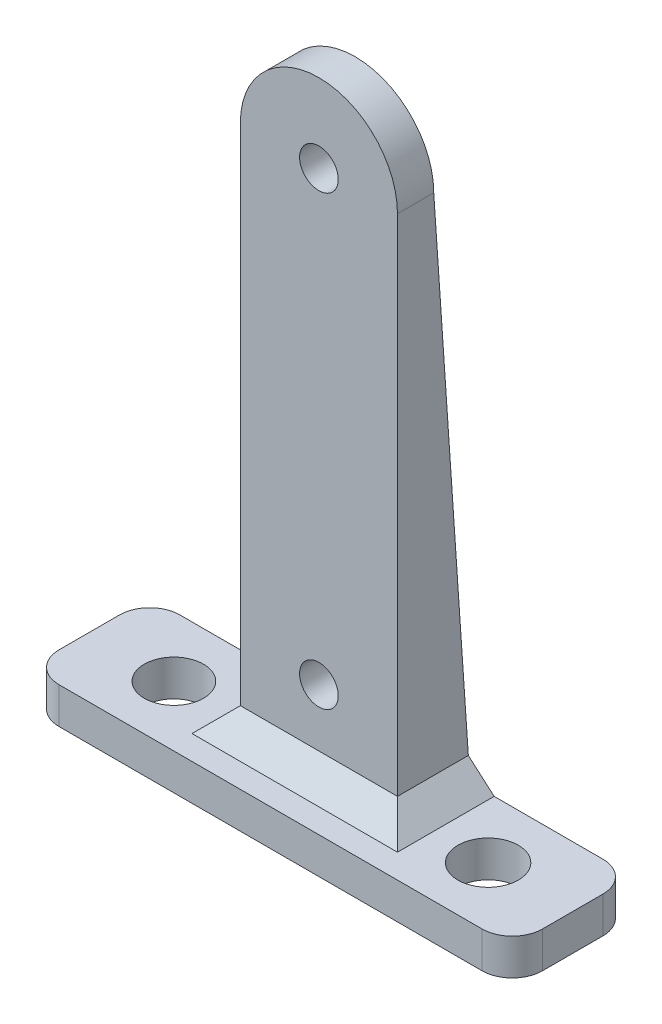
ISO-10303-21;
HEADER;
FILE_DESCRIPTION(('STEP AP214'),'2;1');
FILE_NAME('part.step','',(''),(''),'','','');
FILE_SCHEMA(('AUTOMOTIVE_DESIGN { 1 0 10303 214 1 1 1 1 }'));
ENDSEC;
DATA;
#1=APPLICATION_CONTEXT('core data for automotive mechanical design processes');
#2=APPLICATION_PROTOCOL_DEFINITION('international standard','automotive_design',2000,#1);
#3=PRODUCT_CONTEXT('',#1,'mechanical');
#4=PRODUCT('Part','Part','',(#3));
#5=PRODUCT_RELATED_PRODUCT_CATEGORY('part','',(#4));
#6=PRODUCT_DEFINITION_FORMATION('','',#4);
#7=PRODUCT_DEFINITION_CONTEXT('part definition',#1,'design');
#8=PRODUCT_DEFINITION('design','',#6,#7);
#9=PRODUCT_DEFINITION_SHAPE('','',#8);
#10=(LENGTH_UNIT() NAMED_UNIT(*) SI_UNIT(.MILLI.,.METRE.));
#11=(NAMED_UNIT(*) PLANE_ANGLE_UNIT() SI_UNIT($,.RADIAN.));
#12=(NAMED_UNIT(*) SI_UNIT($,.STERADIAN.) SOLID_ANGLE_UNIT());
#13=UNCERTAINTY_MEASURE_WITH_UNIT(LENGTH_MEASURE(1.E-05),#10,'distance_accuracy_value','');
#14=(GEOMETRIC_REPRESENTATION_CONTEXT(3) GLOBAL_UNCERTAINTY_ASSIGNED_CONTEXT((#13)) GLOBAL_UNIT_ASSIGNED_CONTEXT((#10,
#11,#12)) REPRESENTATION_CONTEXT('',''));
#15=CARTESIAN_POINT('',(0.,0.,0.));
#16=DIRECTION('',(0.,0.,1.));
#17=DIRECTION('',(1.,0.,0.));
#18=AXIS2_PLACEMENT_3D('',#15,#16,#17);
#19=CARTESIAN_POINT('',(0.,3.,0.));
#20=DIRECTION('',(0.,-1.,0.));
#21=DIRECTION('',(0.,0.,-1.));
#22=AXIS2_PLACEMENT_3D('',#19,#20,#21);
#23=PLANE('',#22);
#24=DIRECTION('',(0.,0.,1.));
#25=VECTOR('',#24,1.);
#26=CARTESIAN_POINT('',(24.5,3.,0.));
#27=LINE('',#26,#25);
#28=CARTESIAN_POINT('',(24.5,3.,-10.));
#29=VERTEX_POINT('',#28);
#30=CARTESIAN_POINT('',(24.5,3.,-7.));
#31=VERTEX_POINT('',#30);
#32=EDGE_CURVE('E179',#29,#31,#27,.T.);
#33=ORIENTED_EDGE('',*,*,#32,.F.);
#34=DIRECTION('',(-1.,0.,0.));
#35=VECTOR('',#34,1.);
#36=CARTESIAN_POINT('',(0.,3.,-10.));
#37=LINE('',#36,#35);
#38=CARTESIAN_POINT('',(15.5,3.,-10.));
#39=VERTEX_POINT('',#38);
#40=EDGE_CURVE('E264',#29,#39,#37,.T.);
#41=ORIENTED_EDGE('',*,*,#40,.T.);
#42=DIRECTION('',(0.,0.,-1.));
#43=VECTOR('',#42,1.);
#44=CARTESIAN_POINT('',(15.5,3.,0.));
#45=LINE('',#44,#43);
#46=CARTESIAN_POINT('',(15.5,3.,-7.));
#47=VERTEX_POINT('',#46);
#48=EDGE_CURVE('E204',#47,#39,#45,.T.);
#49=ORIENTED_EDGE('',*,*,#48,.F.);
#50=DIRECTION('',(-1.,0.,0.));
#51=VECTOR('',#50,1.);
#52=CARTESIAN_POINT('',(26.5,3.,-7.));
#53=LINE('',#52,#51);
#54=EDGE_CURVE('E225',#31,#47,#53,.T.);
#55=ORIENTED_EDGE('',*,*,#54,.F.);
#56=EDGE_LOOP('',(#33,#41,#49,#55));
#57=FACE_BOUND('',#56,.T.);
#58=ADVANCED_FACE('F41',(#57),#23,.F.);
#59=CARTESIAN_POINT('',(37.5,3.,-10.));
#60=VERTEX_POINT('',#59);
#61=CARTESIAN_POINT('',(28.5,3.,-10.));
#62=VERTEX_POINT('',#61);
#63=EDGE_CURVE('E260',#60,#62,#37,.T.);
#64=ORIENTED_EDGE('',*,*,#63,.T.);
#65=DIRECTION('',(0.,0.,1.));
#66=VECTOR('',#65,1.);
#67=CARTESIAN_POINT('',(28.5,3.,-4.));
#68=LINE('',#67,#66);
#69=CARTESIAN_POINT('',(28.5,3.,-2.));
#70=VERTEX_POINT('',#69);
#71=EDGE_CURVE('E342',#62,#70,#68,.T.);
#72=ORIENTED_EDGE('',*,*,#71,.T.);
#73=DIRECTION('',(-1.,0.,0.));
#74=VECTOR('',#73,1.);
#75=CARTESIAN_POINT('',(13.5,3.,-2.));
#76=LINE('',#75,#74);
#77=CARTESIAN_POINT('',(11.5,3.,-2.));
#78=VERTEX_POINT('',#77);
#79=EDGE_CURVE('E335',#70,#78,#76,.T.);
#80=ORIENTED_EDGE('',*,*,#79,.T.);
#81=DIRECTION('',(0.,0.,-1.));
#82=VECTOR('',#81,1.);
#83=CARTESIAN_POINT('',(11.5,3.,-10.));
#84=LINE('',#83,#82);
#85=CARTESIAN_POINT('',(11.5,3.00000000000003,-10.));
#86=VERTEX_POINT('',#85);
#87=EDGE_CURVE('E338',#78,#86,#84,.T.);
#88=ORIENTED_EDGE('',*,*,#87,.T.);
#89=CARTESIAN_POINT('',(2.5,3.,-10.));
#90=VERTEX_POINT('',#89);
#91=EDGE_CURVE('E259',#86,#90,#37,.T.);
#92=ORIENTED_EDGE('',*,*,#91,.T.);
#93=CARTESIAN_POINT('',(2.5,3.,-7.5));
#94=DIRECTION('',(0.,-1.,0.));
#95=DIRECTION('',(0.,0.,-1.));
#96=AXIS2_PLACEMENT_3D('',#93,#94,#95);
#97=CIRCLE('',#96,2.5);
#98=CARTESIAN_POINT('',(0.,3.,-7.5));
#99=VERTEX_POINT('',#98);
#100=EDGE_CURVE('E314',#90,#99,#97,.F.);
#101=ORIENTED_EDGE('',*,*,#100,.T.);
#102=DIRECTION('',(0.,0.,1.));
#103=VECTOR('',#102,1.);
#104=CARTESIAN_POINT('',(0.,3.,0.));
#105=LINE('',#104,#103);
#106=CARTESIAN_POINT('',(0.,3.,-2.5));
#107=VERTEX_POINT('',#106);
#108=EDGE_CURVE('E246',#99,#107,#105,.T.);
#109=ORIENTED_EDGE('',*,*,#108,.T.);
#110=CARTESIAN_POINT('',(2.5,3.,-2.5));
#111=DIRECTION('',(0.,-1.,0.));
#112=DIRECTION('',(0.,0.,-1.));
#113=AXIS2_PLACEMENT_3D('',#110,#111,#112);
#114=CIRCLE('',#113,2.5);
#115=CARTESIAN_POINT('',(2.5,3.,0.));
#116=VERTEX_POINT('',#115);
#117=EDGE_CURVE('E305',#107,#116,#114,.F.);
#118=ORIENTED_EDGE('',*,*,#117,.T.);
#119=DIRECTION('',(1.,0.,0.));
#120=VECTOR('',#119,1.);
#121=CARTESIAN_POINT('',(0.,3.,0.));
#122=LINE('',#121,#120);
#123=CARTESIAN_POINT('',(37.5,3.,0.));
#124=VERTEX_POINT('',#123);
#125=EDGE_CURVE('E250',#116,#124,#122,.T.);
#126=ORIENTED_EDGE('',*,*,#125,.T.);
#127=CARTESIAN_POINT('',(37.5,3.,-2.5));
#128=DIRECTION('',(0.,-1.,0.));
#129=DIRECTION('',(0.,0.,-1.));
#130=AXIS2_PLACEMENT_3D('',#127,#128,#129);
#131=CIRCLE('',#130,2.5);
#132=CARTESIAN_POINT('',(40.,3.,-2.5));
#133=VERTEX_POINT('',#132);
#134=EDGE_CURVE('E308',#124,#133,#131,.F.);
#135=ORIENTED_EDGE('',*,*,#134,.T.);
#136=DIRECTION('',(0.,0.,-1.));
#137=VECTOR('',#136,1.);
#138=CARTESIAN_POINT('',(40.,3.,0.));
#139=LINE('',#138,#137);
#140=CARTESIAN_POINT('',(40.,3.,-7.5));
#141=VERTEX_POINT('',#140);
#142=EDGE_CURVE('E255',#133,#141,#139,.T.);
#143=ORIENTED_EDGE('',*,*,#142,.T.);
#144=CARTESIAN_POINT('',(37.5,3.,-7.5));
#145=DIRECTION('',(0.,-1.,0.));
#146=DIRECTION('',(0.,0.,-1.));
#147=AXIS2_PLACEMENT_3D('',#144,#145,#146);
#148=CIRCLE('',#147,2.5);
#149=EDGE_CURVE('E311',#141,#60,#148,.F.);
#150=ORIENTED_EDGE('',*,*,#149,.T.);
#151=EDGE_LOOP('',(#64,#72,#80,#88,#92,#101,#109,#118,#126,#135,#143,#150));
#152=FACE_BOUND('',#151,.T.);
#153=CARTESIAN_POINT('',(7.,3.,-5.));
#154=DIRECTION('',(0.,1.,0.));
#155=DIRECTION('',(0.,0.,1.));
#156=AXIS2_PLACEMENT_3D('',#153,#154,#155);
#157=CIRCLE('',#156,2.45);
#158=CARTESIAN_POINT('',(7.,3.,-2.55));
#159=VERTEX_POINT('',#158);
#160=EDGE_CURVE('E374',#159,#159,#157,.T.);
#161=ORIENTED_EDGE('',*,*,#160,.F.);
#162=EDGE_LOOP('',(#161));
#163=FACE_BOUND('',#162,.T.);
#164=CARTESIAN_POINT('',(33.,3.,-5.));
#165=DIRECTION('',(0.,1.,0.));
#166=DIRECTION('',(0.,0.,1.));
#167=AXIS2_PLACEMENT_3D('',#164,#165,#166);
#168=CIRCLE('',#167,2.5);
#169=CARTESIAN_POINT('',(33.,3.,-2.5));
#170=VERTEX_POINT('',#169);
#171=EDGE_CURVE('E361',#170,#170,#168,.T.);
#172=ORIENTED_EDGE('',*,*,#171,.F.);
#173=EDGE_LOOP('',(#172));
#174=FACE_BOUND('',#173,.T.);
#175=ADVANCED_FACE('F401',(#152,#163,#174),#23,.F.);
#176=CARTESIAN_POINT('',(0.,3.,0.));
#177=DIRECTION('',(1.,0.,0.));
#178=DIRECTION('',(0.,0.,-1.));
#179=AXIS2_PLACEMENT_3D('',#176,#177,#178);
#180=PLANE('',#179);
#181=ORIENTED_EDGE('',*,*,#108,.F.);
#182=DIRECTION('',(0.,-1.,0.));
#183=VECTOR('',#182,1.);
#184=CARTESIAN_POINT('',(0.,3.,-7.5));
#185=LINE('',#184,#183);
#186=CARTESIAN_POINT('',(0.,0.,-7.5));
#187=VERTEX_POINT('',#186);
#188=EDGE_CURVE('E281',#99,#187,#185,.T.);
#189=ORIENTED_EDGE('',*,*,#188,.T.);
#190=DIRECTION('',(0.,0.,1.));
#191=VECTOR('',#190,1.);
#192=CARTESIAN_POINT('',(0.,0.,0.));
#193=LINE('',#192,#191);
#194=CARTESIAN_POINT('',(0.,0.,-2.5));
#195=VERTEX_POINT('',#194);
#196=EDGE_CURVE('E245',#187,#195,#193,.T.);
#197=ORIENTED_EDGE('',*,*,#196,.T.);
#198=DIRECTION('',(0.,-1.,0.));
#199=VECTOR('',#198,1.);
#200=CARTESIAN_POINT('',(0.,3.,-2.5));
#201=LINE('',#200,#199);
#202=EDGE_CURVE('E263',#195,#107,#201,.F.);
#203=ORIENTED_EDGE('',*,*,#202,.T.);
#204=EDGE_LOOP('',(#181,#189,#197,#203));
#205=FACE_BOUND('',#204,.T.);
#206=ADVANCED_FACE('F404',(#205),#180,.F.);
#207=CARTESIAN_POINT('',(0.,3.,0.));
#208=DIRECTION('',(0.,0.,-1.));
#209=DIRECTION('',(-1.,0.,0.));
#210=AXIS2_PLACEMENT_3D('',#207,#208,#209);
#211=PLANE('',#210);
#212=DIRECTION('',(1.,0.,0.));
#213=VECTOR('',#212,1.);
#214=CARTESIAN_POINT('',(0.,0.,0.));
#215=LINE('',#214,#213);
#216=CARTESIAN_POINT('',(2.5,0.,0.));
#217=VERTEX_POINT('',#216);
#218=CARTESIAN_POINT('',(37.5,0.,0.));
#219=VERTEX_POINT('',#218);
#220=EDGE_CURVE('E268',#217,#219,#215,.T.);
#221=ORIENTED_EDGE('',*,*,#220,.T.);
#222=DIRECTION('',(0.,-1.,0.));
#223=VECTOR('',#222,1.);
#224=CARTESIAN_POINT('',(37.5,3.,0.));
#225=LINE('',#224,#223);
#226=EDGE_CURVE('E328',#219,#124,#225,.F.);
#227=ORIENTED_EDGE('',*,*,#226,.T.);
#228=ORIENTED_EDGE('',*,*,#125,.F.);
#229=DIRECTION('',(0.,-1.,0.));
#230=VECTOR('',#229,1.);
#231=CARTESIAN_POINT('',(2.5,3.,0.));
#232=LINE('',#231,#230);
#233=EDGE_CURVE('E324',#116,#217,#232,.T.);
#234=ORIENTED_EDGE('',*,*,#233,.T.);
#235=EDGE_LOOP('',(#221,#227,#228,#234));
#236=FACE_BOUND('',#235,.T.);
#237=ADVANCED_FACE('F411',(#236),#211,.F.);
#238=CARTESIAN_POINT('',(40.,3.,0.));
#239=DIRECTION('',(-1.,0.,0.));
#240=DIRECTION('',(0.,0.,1.));
#241=AXIS2_PLACEMENT_3D('',#238,#239,#240);
#242=PLANE('',#241);
#243=DIRECTION('',(0.,0.,-1.));
#244=VECTOR('',#243,1.);
#245=CARTESIAN_POINT('',(40.,0.,0.));
#246=LINE('',#245,#244);
#247=CARTESIAN_POINT('',(40.,0.,-2.5));
#248=VERTEX_POINT('',#247);
#249=CARTESIAN_POINT('',(40.,0.,-7.5));
#250=VERTEX_POINT('',#249);
#251=EDGE_CURVE('E272',#248,#250,#246,.T.);
#252=ORIENTED_EDGE('',*,*,#251,.T.);
#253=DIRECTION('',(0.,-1.,0.));
#254=VECTOR('',#253,1.);
#255=CARTESIAN_POINT('',(40.,3.,-7.5));
#256=LINE('',#255,#254);
#257=EDGE_CURVE('E321',#250,#141,#256,.F.);
#258=ORIENTED_EDGE('',*,*,#257,.T.);
#259=ORIENTED_EDGE('',*,*,#142,.F.);
#260=DIRECTION('',(0.,-1.,0.));
#261=VECTOR('',#260,1.);
#262=CARTESIAN_POINT('',(40.,3.,-2.5));
#263=LINE('',#262,#261);
#264=EDGE_CURVE('E317',#133,#248,#263,.T.);
#265=ORIENTED_EDGE('',*,*,#264,.T.);
#266=EDGE_LOOP('',(#252,#258,#259,#265));
#267=FACE_BOUND('',#266,.T.);
#268=ADVANCED_FACE('F425',(#267),#242,.F.);
#269=CARTESIAN_POINT('',(0.,3.,-10.));
#270=DIRECTION('',(0.,0.,1.));
#271=DIRECTION('',(1.,0.,0.));
#272=AXIS2_PLACEMENT_3D('',#269,#270,#271);
#273=PLANE('',#272);
#274=DIRECTION('',(-1.,0.,0.));
#275=VECTOR('',#274,1.);
#276=CARTESIAN_POINT('',(0.,0.,-10.));
#277=LINE('',#276,#275);
#278=CARTESIAN_POINT('',(37.5,0.,-10.));
#279=VERTEX_POINT('',#278);
#280=CARTESIAN_POINT('',(2.5,0.,-10.));
#281=VERTEX_POINT('',#280);
#282=EDGE_CURVE('E251',#279,#281,#277,.T.);
#283=ORIENTED_EDGE('',*,*,#282,.T.);
#284=DIRECTION('',(0.,-1.,0.));
#285=VECTOR('',#284,1.);
#286=CARTESIAN_POINT('',(2.5,3.,-10.));
#287=LINE('',#286,#285);
#288=EDGE_CURVE('E301',#281,#90,#287,.F.);
#289=ORIENTED_EDGE('',*,*,#288,.T.);
#290=ORIENTED_EDGE('',*,*,#91,.F.);
#291=DIRECTION('',(1.,0.,0.));
#292=VECTOR('',#291,1.);
#293=CARTESIAN_POINT('',(0.,3.00000000000003,-10.));
#294=LINE('',#293,#292);
#295=EDGE_CURVE('E218',#39,#86,#294,.F.);
#296=ORIENTED_EDGE('',*,*,#295,.F.);
#297=ORIENTED_EDGE('',*,*,#40,.F.);
#298=DIRECTION('',(1.,0.,0.));
#299=VECTOR('',#298,1.);
#300=CARTESIAN_POINT('',(0.,3.00000000000001,-10.));
#301=LINE('',#300,#299);
#302=EDGE_CURVE('E61',#62,#29,#301,.F.);
#303=ORIENTED_EDGE('',*,*,#302,.F.);
#304=ORIENTED_EDGE('',*,*,#63,.F.);
#305=DIRECTION('',(0.,-1.,0.));
#306=VECTOR('',#305,1.);
#307=CARTESIAN_POINT('',(37.5,3.,-10.));
#308=LINE('',#307,#306);
#309=EDGE_CURVE('E297',#60,#279,#308,.T.);
#310=ORIENTED_EDGE('',*,*,#309,.T.);
#311=EDGE_LOOP('',(#283,#289,#290,#296,#297,#303,#304,#310));
#312=FACE_BOUND('',#311,.T.);
#313=ADVANCED_FACE('F422',(#312),#273,.F.);
#314=CARTESIAN_POINT('',(0.,0.,0.));
#315=DIRECTION('',(0.,-1.,0.));
#316=DIRECTION('',(0.,0.,-1.));
#317=AXIS2_PLACEMENT_3D('',#314,#315,#316);
#318=PLANE('',#317);
#319=CARTESIAN_POINT('',(7.,0.,-5.));
#320=DIRECTION('',(0.,1.,0.));
#321=DIRECTION('',(0.,0.,1.));
#322=AXIS2_PLACEMENT_3D('',#319,#320,#321);
#323=CIRCLE('',#322,2.45);
#324=CARTESIAN_POINT('',(7.,0.,-2.55));
#325=VERTEX_POINT('',#324);
#326=EDGE_CURVE('E387',#325,#325,#323,.T.);
#327=ORIENTED_EDGE('',*,*,#326,.T.);
#328=EDGE_LOOP('',(#327));
#329=FACE_BOUND('',#328,.T.);
#330=CARTESIAN_POINT('',(33.,0.,-5.));
#331=DIRECTION('',(0.,1.,0.));
#332=DIRECTION('',(0.,0.,1.));
#333=AXIS2_PLACEMENT_3D('',#330,#331,#332);
#334=CIRCLE('',#333,2.5);
#335=CARTESIAN_POINT('',(33.,0.,-2.5));
#336=VERTEX_POINT('',#335);
#337=EDGE_CURVE('E368',#336,#336,#334,.T.);
#338=ORIENTED_EDGE('',*,*,#337,.T.);
#339=EDGE_LOOP('',(#338));
#340=FACE_BOUND('',#339,.T.);
#341=ORIENTED_EDGE('',*,*,#196,.F.);
#342=CARTESIAN_POINT('',(2.5,0.,-7.5));
#343=DIRECTION('',(0.,-1.,0.));
#344=DIRECTION('',(0.,0.,-1.));
#345=AXIS2_PLACEMENT_3D('',#342,#343,#344);
#346=CIRCLE('',#345,2.5);
#347=EDGE_CURVE('E294',#187,#281,#346,.T.);
#348=ORIENTED_EDGE('',*,*,#347,.T.);
#349=ORIENTED_EDGE('',*,*,#282,.F.);
#350=CARTESIAN_POINT('',(37.5,0.,-7.5));
#351=DIRECTION('',(0.,-1.,0.));
#352=DIRECTION('',(0.,0.,-1.));
#353=AXIS2_PLACEMENT_3D('',#350,#351,#352);
#354=CIRCLE('',#353,2.5);
#355=EDGE_CURVE('E291',#279,#250,#354,.T.);
#356=ORIENTED_EDGE('',*,*,#355,.T.);
#357=ORIENTED_EDGE('',*,*,#251,.F.);
#358=CARTESIAN_POINT('',(37.5,0.,-2.5));
#359=DIRECTION('',(0.,-1.,0.));
#360=DIRECTION('',(0.,0.,-1.));
#361=AXIS2_PLACEMENT_3D('',#358,#359,#360);
#362=CIRCLE('',#361,2.5);
#363=EDGE_CURVE('E288',#248,#219,#362,.T.);
#364=ORIENTED_EDGE('',*,*,#363,.T.);
#365=ORIENTED_EDGE('',*,*,#220,.F.);
#366=CARTESIAN_POINT('',(2.5,0.,-2.5));
#367=DIRECTION('',(0.,-1.,0.));
#368=DIRECTION('',(0.,0.,-1.));
#369=AXIS2_PLACEMENT_3D('',#366,#367,#368);
#370=CIRCLE('',#369,2.5);
#371=EDGE_CURVE('E285',#217,#195,#370,.T.);
#372=ORIENTED_EDGE('',*,*,#371,.T.);
#373=EDGE_LOOP('',(#341,#348,#349,#356,#357,#364,#365,#372));
#374=FACE_BOUND('',#373,.T.);
#375=ADVANCED_FACE('F419',(#329,#340,#374),#318,.T.);
#376=CARTESIAN_POINT('',(13.5,46.75,-7.));
#377=DIRECTION('',(1.,0.,0.));
#378=DIRECTION('',(0.,0.,-1.));
#379=AXIS2_PLACEMENT_3D('',#376,#377,#378);
#380=PLANE('',#379);
#381=DIRECTION('',(0.,0.997657238183404,0.068410782046862));
#382=VECTOR('',#381,1.);
#383=CARTESIAN_POINT('',(13.5,3.,-10.));
#384=LINE('',#383,#382);
#385=CARTESIAN_POINT('',(13.5,5.00000000000002,-9.86285714285714));
#386=VERTEX_POINT('',#385);
#387=CARTESIAN_POINT('',(13.5,46.75,-7.));
#388=VERTEX_POINT('',#387);
#389=EDGE_CURVE('E201',#386,#388,#384,.T.);
#390=ORIENTED_EDGE('',*,*,#389,.F.);
#391=DIRECTION('',(0.,0.,1.));
#392=VECTOR('',#391,1.);
#393=CARTESIAN_POINT('',(13.5,5.00000000000002,-4.));
#394=LINE('',#393,#392);
#395=CARTESIAN_POINT('',(13.5,5.00000000000002,-4.));
#396=VERTEX_POINT('',#395);
#397=EDGE_CURVE('E345',#386,#396,#394,.T.);
#398=ORIENTED_EDGE('',*,*,#397,.T.);
#399=DIRECTION('',(0.,-1.,0.));
#400=VECTOR('',#399,1.);
#401=CARTESIAN_POINT('',(13.5,46.75,-4.));
#402=LINE('',#401,#400);
#403=CARTESIAN_POINT('',(13.5,46.75,-4.));
#404=VERTEX_POINT('',#403);
#405=EDGE_CURVE('E241',#404,#396,#402,.T.);
#406=ORIENTED_EDGE('',*,*,#405,.F.);
#407=DIRECTION('',(0.,0.,1.));
#408=VECTOR('',#407,1.);
#409=CARTESIAN_POINT('',(13.5,46.75,-7.));
#410=LINE('',#409,#408);
#411=EDGE_CURVE('E228',#388,#404,#410,.T.);
#412=ORIENTED_EDGE('',*,*,#411,.F.);
#413=EDGE_LOOP('',(#390,#398,#406,#412));
#414=FACE_BOUND('',#413,.T.);
#415=ADVANCED_FACE('F417',(#414),#380,.F.);
#416=CARTESIAN_POINT('',(13.5,46.75,-4.));
#417=DIRECTION('',(0.,0.,-1.));
#418=DIRECTION('',(-1.,0.,0.));
#419=AXIS2_PLACEMENT_3D('',#416,#417,#418);
#420=PLANE('',#419);
#421=CARTESIAN_POINT('',(20.,9.75,-4.));
#422=DIRECTION('',(0.,0.,1.));
#423=DIRECTION('',(1.,0.,0.));
#424=AXIS2_PLACEMENT_3D('',#421,#422,#423);
#425=CIRCLE('',#424,1.6);
#426=CARTESIAN_POINT('',(21.6,9.75,-4.));
#427=VERTEX_POINT('',#426);
#428=EDGE_CURVE('E192',#427,#427,#425,.T.);
#429=ORIENTED_EDGE('',*,*,#428,.F.);
#430=EDGE_LOOP('',(#429));
#431=FACE_BOUND('',#430,.T.);
#432=CARTESIAN_POINT('',(20.,46.75,-4.));
#433=DIRECTION('',(0.,0.,1.));
#434=DIRECTION('',(1.,0.,0.));
#435=AXIS2_PLACEMENT_3D('',#432,#433,#434);
#436=CIRCLE('',#435,1.6);
#437=CARTESIAN_POINT('',(21.6,46.75,-4.));
#438=VERTEX_POINT('',#437);
#439=EDGE_CURVE('E384',#438,#438,#436,.T.);
#440=ORIENTED_EDGE('',*,*,#439,.F.);
#441=EDGE_LOOP('',(#440));
#442=FACE_BOUND('',#441,.T.);
#443=ORIENTED_EDGE('',*,*,#405,.T.);
#444=DIRECTION('',(1.,0.,0.));
#445=VECTOR('',#444,1.);
#446=CARTESIAN_POINT('',(26.5,5.00000000000002,-4.));
#447=LINE('',#446,#445);
#448=CARTESIAN_POINT('',(26.5,5.00000000000002,-4.));
#449=VERTEX_POINT('',#448);
#450=EDGE_CURVE('E348',#396,#449,#447,.T.);
#451=ORIENTED_EDGE('',*,*,#450,.T.);
#452=DIRECTION('',(0.,-1.,0.));
#453=VECTOR('',#452,1.);
#454=CARTESIAN_POINT('',(26.5,46.75,-4.));
#455=LINE('',#454,#453);
#456=CARTESIAN_POINT('',(26.5,46.75,-4.));
#457=VERTEX_POINT('',#456);
#458=EDGE_CURVE('E235',#457,#449,#455,.T.);
#459=ORIENTED_EDGE('',*,*,#458,.F.);
#460=CARTESIAN_POINT('',(20.,46.75,-4.));
#461=DIRECTION('',(0.,0.,1.));
#462=DIRECTION('',(1.,0.,0.));
#463=AXIS2_PLACEMENT_3D('',#460,#461,#462);
#464=CIRCLE('',#463,6.5);
#465=EDGE_CURVE('E222',#457,#404,#464,.T.);
#466=ORIENTED_EDGE('',*,*,#465,.T.);
#467=EDGE_LOOP('',(#443,#451,#459,#466));
#468=FACE_BOUND('',#467,.T.);
#469=ADVANCED_FACE('F488',(#431,#442,#468),#420,.F.);
#470=CARTESIAN_POINT('',(26.5,46.75,-7.));
#471=DIRECTION('',(-1.,0.,0.));
#472=DIRECTION('',(0.,0.,1.));
#473=AXIS2_PLACEMENT_3D('',#470,#471,#472);
#474=PLANE('',#473);
#475=ORIENTED_EDGE('',*,*,#458,.T.);
#476=DIRECTION('',(0.,0.,-1.));
#477=VECTOR('',#476,1.);
#478=CARTESIAN_POINT('',(26.5,5.00000000000002,-10.));
#479=LINE('',#478,#477);
#480=CARTESIAN_POINT('',(26.5,5.00000000000002,-9.86285714285714));
#481=VERTEX_POINT('',#480);
#482=EDGE_CURVE('E331',#449,#481,#479,.T.);
#483=ORIENTED_EDGE('',*,*,#482,.T.);
#484=DIRECTION('',(0.,-0.997657238183404,-0.068410782046862));
#485=VECTOR('',#484,1.);
#486=CARTESIAN_POINT('',(26.5,46.75,-7.));
#487=LINE('',#486,#485);
#488=CARTESIAN_POINT('',(26.5,46.75,-7.));
#489=VERTEX_POINT('',#488);
#490=EDGE_CURVE('E185',#489,#481,#487,.T.);
#491=ORIENTED_EDGE('',*,*,#490,.F.);
#492=DIRECTION('',(0.,0.,-1.));
#493=VECTOR('',#492,1.);
#494=CARTESIAN_POINT('',(26.5,46.75,-7.));
#495=LINE('',#494,#493);
#496=EDGE_CURVE('E232',#457,#489,#495,.T.);
#497=ORIENTED_EDGE('',*,*,#496,.F.);
#498=EDGE_LOOP('',(#475,#483,#491,#497));
#499=FACE_BOUND('',#498,.T.);
#500=ADVANCED_FACE('F486',(#499),#474,.F.);
#501=CARTESIAN_POINT('',(26.5,46.75,-7.));
#502=DIRECTION('',(0.,0.,1.));
#503=DIRECTION('',(1.,0.,0.));
#504=AXIS2_PLACEMENT_3D('',#501,#502,#503);
#505=PLANE('',#504);
#506=CARTESIAN_POINT('',(20.,9.75,-7.));
#507=DIRECTION('',(0.,0.,1.));
#508=DIRECTION('',(1.,0.,0.));
#509=AXIS2_PLACEMENT_3D('',#506,#507,#508);
#510=CIRCLE('',#509,1.6);
#511=CARTESIAN_POINT('',(21.6,9.75,-7.));
#512=VERTEX_POINT('',#511);
#513=EDGE_CURVE('E186',#512,#512,#510,.T.);
#514=ORIENTED_EDGE('',*,*,#513,.T.);
#515=EDGE_LOOP('',(#514));
#516=FACE_BOUND('',#515,.T.);
#517=CARTESIAN_POINT('',(20.,46.75,-7.));
#518=DIRECTION('',(0.,0.,1.));
#519=DIRECTION('',(1.,0.,0.));
#520=AXIS2_PLACEMENT_3D('',#517,#518,#519);
#521=CIRCLE('',#520,1.6);
#522=CARTESIAN_POINT('',(21.6,46.75,-7.));
#523=VERTEX_POINT('',#522);
#524=EDGE_CURVE('E381',#523,#523,#521,.T.);
#525=ORIENTED_EDGE('',*,*,#524,.T.);
#526=EDGE_LOOP('',(#525));
#527=FACE_BOUND('',#526,.T.);
#528=CARTESIAN_POINT('',(20.,46.75,-7.));
#529=DIRECTION('',(0.,0.,1.));
#530=DIRECTION('',(1.,0.,0.));
#531=AXIS2_PLACEMENT_3D('',#528,#529,#530);
#532=CIRCLE('',#531,6.5);
#533=EDGE_CURVE('E167',#489,#388,#532,.T.);
#534=ORIENTED_EDGE('',*,*,#533,.F.);
#535=DIRECTION('',(1.,0.,0.));
#536=VECTOR('',#535,1.);
#537=CARTESIAN_POINT('',(26.5,46.75,-7.));
#538=LINE('',#537,#536);
#539=CARTESIAN_POINT('',(24.5,46.75,-7.));
#540=VERTEX_POINT('',#539);
#541=EDGE_CURVE('E160',#489,#540,#538,.F.);
#542=ORIENTED_EDGE('',*,*,#541,.T.);
#543=DIRECTION('',(0.,1.,0.));
#544=VECTOR('',#543,1.);
#545=CARTESIAN_POINT('',(24.5,46.75,-7.));
#546=LINE('',#545,#544);
#547=EDGE_CURVE('E163',#31,#540,#546,.T.);
#548=ORIENTED_EDGE('',*,*,#547,.F.);
#549=ORIENTED_EDGE('',*,*,#54,.T.);
#550=DIRECTION('',(0.,-1.,0.));
#551=VECTOR('',#550,1.);
#552=CARTESIAN_POINT('',(15.5,46.75,-7.));
#553=LINE('',#552,#551);
#554=CARTESIAN_POINT('',(15.5,46.7500000000004,-6.99999999999999));
#555=VERTEX_POINT('',#554);
#556=EDGE_CURVE('E211',#555,#47,#553,.T.);
#557=ORIENTED_EDGE('',*,*,#556,.F.);
#558=DIRECTION('',(1.,0.,0.));
#559=VECTOR('',#558,1.);
#560=CARTESIAN_POINT('',(26.5,46.75,-7.));
#561=LINE('',#560,#559);
#562=EDGE_CURVE('E215',#555,#388,#561,.F.);
#563=ORIENTED_EDGE('',*,*,#562,.T.);
#564=EDGE_LOOP('',(#534,#542,#548,#549,#557,#563));
#565=FACE_BOUND('',#564,.T.);
#566=ADVANCED_FACE('F162',(#516,#527,#565),#505,.F.);
#567=CARTESIAN_POINT('',(20.,46.75,-7.));
#568=DIRECTION('',(0.,0.,1.));
#569=DIRECTION('',(1.,0.,0.));
#570=AXIS2_PLACEMENT_3D('',#567,#568,#569);
#571=CYLINDRICAL_SURFACE('',#570,6.5);
#572=ORIENTED_EDGE('',*,*,#496,.T.);
#573=ORIENTED_EDGE('',*,*,#533,.T.);
#574=ORIENTED_EDGE('',*,*,#411,.T.);
#575=ORIENTED_EDGE('',*,*,#465,.F.);
#576=EDGE_LOOP('',(#572,#573,#574,#575));
#577=FACE_BOUND('',#576,.T.);
#578=ADVANCED_FACE('F483',(#577),#571,.T.);
#579=CARTESIAN_POINT('',(13.5,3.,-10.));
#580=DIRECTION('',(0.,-0.0684107820468621,0.997657238183404));
#581=DIRECTION('',(0.,0.997657238183404,0.068410782046862));
#582=AXIS2_PLACEMENT_3D('',#579,#580,#581);
#583=PLANE('',#582);
#584=DIRECTION('',(0.,0.997657238183404,0.068410782046862));
#585=VECTOR('',#584,1.);
#586=CARTESIAN_POINT('',(15.5,3.,-10.));
#587=LINE('',#586,#585);
#588=EDGE_CURVE('E200',#39,#555,#587,.T.);
#589=ORIENTED_EDGE('',*,*,#588,.F.);
#590=ORIENTED_EDGE('',*,*,#295,.T.);
#591=DIRECTION('',(0.706277032730244,0.706277032730252,0.0484304251015031));
#592=VECTOR('',#591,1.);
#593=CARTESIAN_POINT('',(13.5979248786526,5.09792487865266,-9.85614229403525));
#594=LINE('',#593,#592);
#595=EDGE_CURVE('E11',#86,#386,#594,.T.);
#596=ORIENTED_EDGE('',*,*,#595,.T.);
#597=ORIENTED_EDGE('',*,*,#389,.T.);
#598=ORIENTED_EDGE('',*,*,#562,.F.);
#599=EDGE_LOOP('',(#589,#590,#596,#597,#598));
#600=FACE_BOUND('',#599,.T.);
#601=ADVANCED_FACE('F475',(#600),#583,.F.);
#602=CARTESIAN_POINT('',(15.5,26.625,-5.));
#603=DIRECTION('',(-1.,0.,0.));
#604=DIRECTION('',(0.,0.,1.));
#605=AXIS2_PLACEMENT_3D('',#602,#603,#604);
#606=PLANE('',#605);
#607=ORIENTED_EDGE('',*,*,#588,.T.);
#608=ORIENTED_EDGE('',*,*,#556,.T.);
#609=ORIENTED_EDGE('',*,*,#48,.T.);
#610=EDGE_LOOP('',(#607,#608,#609));
#611=FACE_BOUND('',#610,.T.);
#612=ADVANCED_FACE('F514',(#611),#606,.F.);
#613=CARTESIAN_POINT('',(26.5,46.75,-7.));
#614=DIRECTION('',(0.,-0.068410782046862,0.997657238183404));
#615=DIRECTION('',(0.,-0.997657238183404,-0.068410782046862));
#616=AXIS2_PLACEMENT_3D('',#613,#614,#615);
#617=PLANE('',#616);
#618=ORIENTED_EDGE('',*,*,#490,.T.);
#619=DIRECTION('',(0.706277032730244,-0.706277032730252,-0.048430425101503));
#620=VECTOR('',#619,1.);
#621=CARTESIAN_POINT('',(26.4020751213474,5.09792487865266,-9.85614229403525));
#622=LINE('',#621,#620);
#623=EDGE_CURVE('E53',#481,#62,#622,.T.);
#624=ORIENTED_EDGE('',*,*,#623,.T.);
#625=ORIENTED_EDGE('',*,*,#302,.T.);
#626=DIRECTION('',(0.,-0.997657238183404,-0.068410782046862));
#627=VECTOR('',#626,1.);
#628=CARTESIAN_POINT('',(24.5,46.75,-7.));
#629=LINE('',#628,#627);
#630=EDGE_CURVE('E178',#540,#29,#629,.T.);
#631=ORIENTED_EDGE('',*,*,#630,.F.);
#632=ORIENTED_EDGE('',*,*,#541,.F.);
#633=EDGE_LOOP('',(#618,#624,#625,#631,#632));
#634=FACE_BOUND('',#633,.T.);
#635=ADVANCED_FACE('F182',(#634),#617,.F.);
#636=CARTESIAN_POINT('',(24.5,26.625,-5.));
#637=DIRECTION('',(1.,0.,0.));
#638=DIRECTION('',(0.,0.,-1.));
#639=AXIS2_PLACEMENT_3D('',#636,#637,#638);
#640=PLANE('',#639);
#641=ORIENTED_EDGE('',*,*,#32,.T.);
#642=ORIENTED_EDGE('',*,*,#547,.T.);
#643=ORIENTED_EDGE('',*,*,#630,.T.);
#644=EDGE_LOOP('',(#641,#642,#643));
#645=FACE_BOUND('',#644,.T.);
#646=ADVANCED_FACE('F177',(#645),#640,.F.);
#647=CARTESIAN_POINT('',(20.,46.75,-7.));
#648=DIRECTION('',(0.,0.,1.));
#649=DIRECTION('',(1.,0.,0.));
#650=AXIS2_PLACEMENT_3D('',#647,#648,#649);
#651=CYLINDRICAL_SURFACE('',#650,1.6);
#652=ORIENTED_EDGE('',*,*,#524,.F.);
#653=EDGE_LOOP('',(#652));
#654=FACE_BOUND('',#653,.T.);
#655=ORIENTED_EDGE('',*,*,#439,.T.);
#656=EDGE_LOOP('',(#655));
#657=FACE_BOUND('',#656,.T.);
#658=ADVANCED_FACE('F540',(#654,#657),#651,.F.);
#659=CARTESIAN_POINT('',(20.,9.75,-7.));
#660=DIRECTION('',(0.,0.,1.));
#661=DIRECTION('',(1.,0.,0.));
#662=AXIS2_PLACEMENT_3D('',#659,#660,#661);
#663=CYLINDRICAL_SURFACE('',#662,1.6);
#664=ORIENTED_EDGE('',*,*,#513,.F.);
#665=EDGE_LOOP('',(#664));
#666=FACE_BOUND('',#665,.T.);
#667=ORIENTED_EDGE('',*,*,#428,.T.);
#668=EDGE_LOOP('',(#667));
#669=FACE_BOUND('',#668,.T.);
#670=ADVANCED_FACE('F436',(#666,#669),#663,.F.);
#671=CARTESIAN_POINT('',(2.5,3.,-7.5));
#672=DIRECTION('',(0.,-1.,0.));
#673=DIRECTION('',(0.,0.,-1.));
#674=AXIS2_PLACEMENT_3D('',#671,#672,#673);
#675=CYLINDRICAL_SURFACE('',#674,2.5);
#676=ORIENTED_EDGE('',*,*,#100,.F.);
#677=ORIENTED_EDGE('',*,*,#288,.F.);
#678=ORIENTED_EDGE('',*,*,#347,.F.);
#679=ORIENTED_EDGE('',*,*,#188,.F.);
#680=EDGE_LOOP('',(#676,#677,#678,#679));
#681=FACE_BOUND('',#680,.T.);
#682=ADVANCED_FACE('F432',(#681),#675,.T.);
#683=CARTESIAN_POINT('',(37.5,3.,-7.5));
#684=DIRECTION('',(0.,-1.,0.));
#685=DIRECTION('',(0.,0.,-1.));
#686=AXIS2_PLACEMENT_3D('',#683,#684,#685);
#687=CYLINDRICAL_SURFACE('',#686,2.5);
#688=ORIENTED_EDGE('',*,*,#149,.F.);
#689=ORIENTED_EDGE('',*,*,#257,.F.);
#690=ORIENTED_EDGE('',*,*,#355,.F.);
#691=ORIENTED_EDGE('',*,*,#309,.F.);
#692=EDGE_LOOP('',(#688,#689,#690,#691));
#693=FACE_BOUND('',#692,.T.);
#694=ADVANCED_FACE('F435',(#693),#687,.T.);
#695=CARTESIAN_POINT('',(37.5,3.,-2.5));
#696=DIRECTION('',(0.,-1.,0.));
#697=DIRECTION('',(0.,0.,-1.));
#698=AXIS2_PLACEMENT_3D('',#695,#696,#697);
#699=CYLINDRICAL_SURFACE('',#698,2.5);
#700=ORIENTED_EDGE('',*,*,#134,.F.);
#701=ORIENTED_EDGE('',*,*,#226,.F.);
#702=ORIENTED_EDGE('',*,*,#363,.F.);
#703=ORIENTED_EDGE('',*,*,#264,.F.);
#704=EDGE_LOOP('',(#700,#701,#702,#703));
#705=FACE_BOUND('',#704,.T.);
#706=ADVANCED_FACE('F440',(#705),#699,.T.);
#707=CARTESIAN_POINT('',(2.5,3.,-2.5));
#708=DIRECTION('',(0.,-1.,0.));
#709=DIRECTION('',(0.,0.,-1.));
#710=AXIS2_PLACEMENT_3D('',#707,#708,#709);
#711=CYLINDRICAL_SURFACE('',#710,2.5);
#712=ORIENTED_EDGE('',*,*,#117,.F.);
#713=ORIENTED_EDGE('',*,*,#202,.F.);
#714=ORIENTED_EDGE('',*,*,#371,.F.);
#715=ORIENTED_EDGE('',*,*,#233,.F.);
#716=EDGE_LOOP('',(#712,#713,#714,#715));
#717=FACE_BOUND('',#716,.T.);
#718=ADVANCED_FACE('F444',(#717),#711,.T.);
#719=CARTESIAN_POINT('',(33.,0.,-5.));
#720=DIRECTION('',(0.,1.,0.));
#721=DIRECTION('',(0.,0.,1.));
#722=AXIS2_PLACEMENT_3D('',#719,#720,#721);
#723=CYLINDRICAL_SURFACE('',#722,2.5);
#724=ORIENTED_EDGE('',*,*,#337,.F.);
#725=EDGE_LOOP('',(#724));
#726=FACE_BOUND('',#725,.T.);
#727=ORIENTED_EDGE('',*,*,#171,.T.);
#728=EDGE_LOOP('',(#727));
#729=FACE_BOUND('',#728,.T.);
#730=ADVANCED_FACE('F448',(#726,#729),#723,.F.);
#731=CARTESIAN_POINT('',(7.,0.,-5.));
#732=DIRECTION('',(0.,1.,0.));
#733=DIRECTION('',(0.,0.,1.));
#734=AXIS2_PLACEMENT_3D('',#731,#732,#733);
#735=CYLINDRICAL_SURFACE('',#734,2.45);
#736=ORIENTED_EDGE('',*,*,#326,.F.);
#737=EDGE_LOOP('',(#736));
#738=FACE_BOUND('',#737,.T.);
#739=ORIENTED_EDGE('',*,*,#160,.T.);
#740=EDGE_LOOP('',(#739));
#741=FACE_BOUND('',#740,.T.);
#742=ADVANCED_FACE('F399',(#738,#741),#735,.F.);
#743=CARTESIAN_POINT('',(13.5,5.00000000000002,-7.));
#744=DIRECTION('',(-0.707106781186552,0.707106781186543,0.));
#745=DIRECTION('',(0.,0.,-1.));
#746=AXIS2_PLACEMENT_3D('',#743,#744,#745);
#747=PLANE('',#746);
#748=ORIENTED_EDGE('',*,*,#595,.F.);
#749=ORIENTED_EDGE('',*,*,#87,.F.);
#750=DIRECTION('',(-0.577350269189624,-0.57735026918963,0.577350269189624));
#751=VECTOR('',#750,1.);
#752=CARTESIAN_POINT('',(13.5,5.00000000000002,-4.));
#753=LINE('',#752,#751);
#754=EDGE_CURVE('E46',#396,#78,#753,.T.);
#755=ORIENTED_EDGE('',*,*,#754,.F.);
#756=ORIENTED_EDGE('',*,*,#397,.F.);
#757=EDGE_LOOP('',(#748,#749,#755,#756));
#758=FACE_BOUND('',#757,.T.);
#759=ADVANCED_FACE('F44',(#758),#747,.T.);
#760=CARTESIAN_POINT('',(13.5,5.00000000000002,-4.));
#761=DIRECTION('',(0.,0.707106781186543,0.707106781186552));
#762=DIRECTION('',(-1.,0.,0.));
#763=AXIS2_PLACEMENT_3D('',#760,#761,#762);
#764=PLANE('',#763);
#765=ORIENTED_EDGE('',*,*,#754,.T.);
#766=ORIENTED_EDGE('',*,*,#79,.F.);
#767=DIRECTION('',(-0.577350269189624,0.57735026918963,-0.577350269189624));
#768=VECTOR('',#767,1.);
#769=CARTESIAN_POINT('',(22.1666666666667,9.33333333333337,-8.3333333333333));
#770=LINE('',#769,#768);
#771=EDGE_CURVE('E352',#449,#70,#770,.F.);
#772=ORIENTED_EDGE('',*,*,#771,.F.);
#773=ORIENTED_EDGE('',*,*,#450,.F.);
#774=EDGE_LOOP('',(#765,#766,#772,#773));
#775=FACE_BOUND('',#774,.T.);
#776=ADVANCED_FACE('F456',(#775),#764,.T.);
#777=CARTESIAN_POINT('',(26.5,5.00000000000002,-7.));
#778=DIRECTION('',(0.707106781186552,0.707106781186543,0.));
#779=DIRECTION('',(0.,0.,1.));
#780=AXIS2_PLACEMENT_3D('',#777,#778,#779);
#781=PLANE('',#780);
#782=ORIENTED_EDGE('',*,*,#771,.T.);
#783=ORIENTED_EDGE('',*,*,#71,.F.);
#784=ORIENTED_EDGE('',*,*,#623,.F.);
#785=ORIENTED_EDGE('',*,*,#482,.F.);
#786=EDGE_LOOP('',(#782,#783,#784,#785));
#787=FACE_BOUND('',#786,.T.);
#788=ADVANCED_FACE('F451',(#787),#781,.T.);
#789=CLOSED_SHELL('',(#58,#175,#206,#237,#268,#313,#375,#415,#469,#500,#566,#578,#601,#612,#635,
#646,#658,#670,#682,#694,#706,#718,#730,#742,#759,#776,#788));
#790=MANIFOLD_SOLID_BREP('B2',#789);
#791=ADVANCED_BREP_SHAPE_REPRESENTATION('',(#18,#790),#14);
#792=SHAPE_DEFINITION_REPRESENTATION(#9,#791);
ENDSEC;
END-ISO-10303-21;
